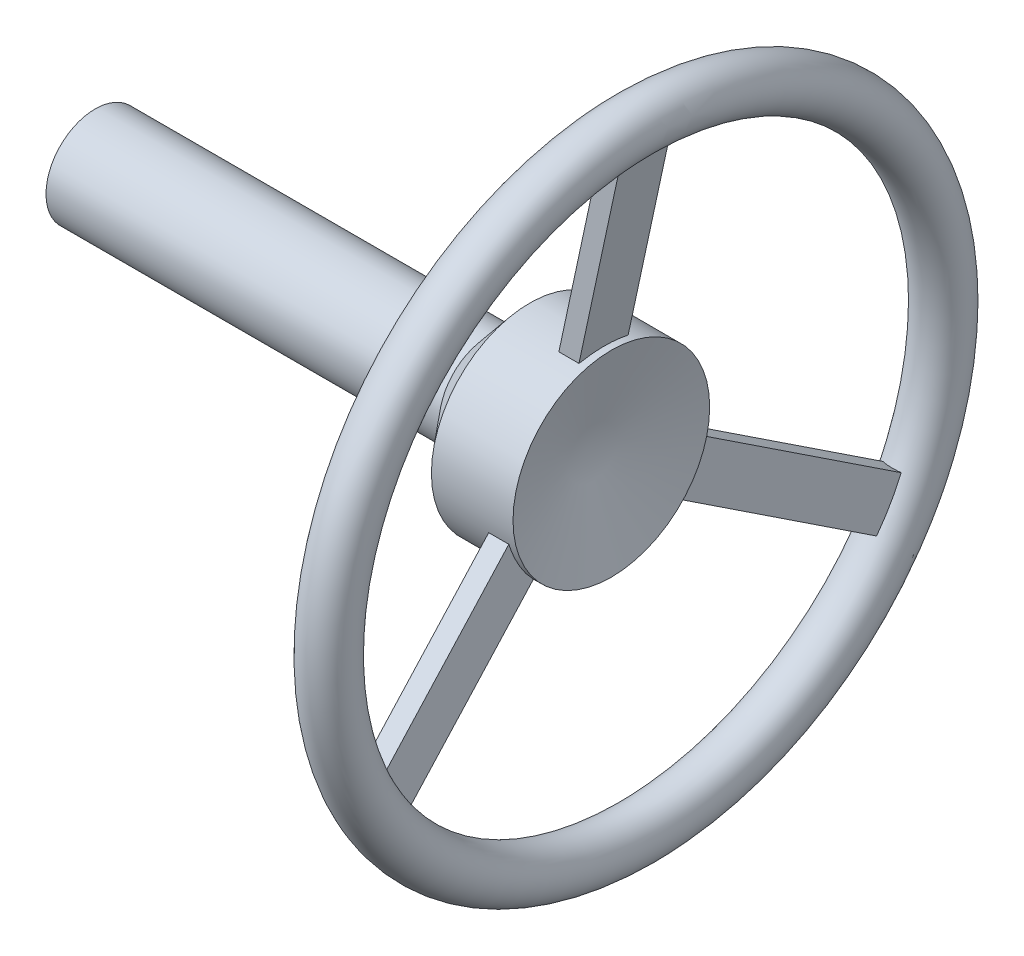
ISO-10303-21;
HEADER;
FILE_DESCRIPTION(('STEP AP214'),'2;1');
FILE_NAME('part.step','',(''),(''),'','','');
FILE_SCHEMA(('AUTOMOTIVE_DESIGN { 1 0 10303 214 1 1 1 1 }'));
ENDSEC;
DATA;
#1=APPLICATION_CONTEXT('core data for automotive mechanical design processes');
#2=APPLICATION_PROTOCOL_DEFINITION('international standard','automotive_design',2000,#1);
#3=PRODUCT_CONTEXT('',#1,'mechanical');
#4=PRODUCT('Part','Part','',(#3));
#5=PRODUCT_RELATED_PRODUCT_CATEGORY('part','',(#4));
#6=PRODUCT_DEFINITION_FORMATION('','',#4);
#7=PRODUCT_DEFINITION_CONTEXT('part definition',#1,'design');
#8=PRODUCT_DEFINITION('design','',#6,#7);
#9=PRODUCT_DEFINITION_SHAPE('','',#8);
#10=(LENGTH_UNIT() NAMED_UNIT(*) SI_UNIT(.MILLI.,.METRE.));
#11=(NAMED_UNIT(*) PLANE_ANGLE_UNIT() SI_UNIT($,.RADIAN.));
#12=(NAMED_UNIT(*) SI_UNIT($,.STERADIAN.) SOLID_ANGLE_UNIT());
#13=UNCERTAINTY_MEASURE_WITH_UNIT(LENGTH_MEASURE(1.E-05),#10,'distance_accuracy_value','');
#14=(GEOMETRIC_REPRESENTATION_CONTEXT(3) GLOBAL_UNCERTAINTY_ASSIGNED_CONTEXT((#13)) GLOBAL_UNIT_ASSIGNED_CONTEXT((#10,
#11,#12)) REPRESENTATION_CONTEXT('',''));
#15=CARTESIAN_POINT('',(0.,0.,0.));
#16=DIRECTION('',(0.,0.,1.));
#17=DIRECTION('',(1.,0.,0.));
#18=AXIS2_PLACEMENT_3D('',#15,#16,#17);
#19=CARTESIAN_POINT('',(-81.8695941450432,0.,0.));
#20=DIRECTION('',(-1.,0.,0.));
#21=DIRECTION('',(0.,0.,1.));
#22=AXIS2_PLACEMENT_3D('',#19,#20,#21);
#23=CYLINDRICAL_SURFACE('',#22,10.);
#24=DIRECTION('',(-1.,0.,0.));
#25=VECTOR('',#24,1.);
#26=CARTESIAN_POINT('',(-81.8695941450432,-7.0062926922203,7.13525491562427));
#27=LINE('',#26,#25);
#28=CARTESIAN_POINT('',(49.658011720403,-7.0062926922203,7.13525491562427));
#29=VERTEX_POINT('',#28);
#30=CARTESIAN_POINT('',(51.7036199719426,-7.0062926922203,7.13525491562427));
#31=VERTEX_POINT('',#30);
#32=EDGE_CURVE('E297',#29,#31,#27,.F.);
#33=ORIENTED_EDGE('',*,*,#32,.F.);
#34=CARTESIAN_POINT('',(47.5784621968035,0.,0.));
#35=DIRECTION('',(0.977704307994792,0.104993197551584,-0.181853552608464));
#36=DIRECTION('',(-0.209986395103172,0.488852153997388,-0.846716768112979));
#37=AXIS2_PLACEMENT_3D('',#34,#35,#36);
#38=ELLIPSE('',#37,10.2280412576982,10.);
#39=CARTESIAN_POINT('',(49.658011720403,-2.67616567329808,9.63525491562423));
#40=VERTEX_POINT('',#39);
#41=EDGE_CURVE('E295',#40,#29,#38,.T.);
#42=ORIENTED_EDGE('',*,*,#41,.F.);
#43=DIRECTION('',(-1.,0.,0.));
#44=VECTOR('',#43,1.);
#45=CARTESIAN_POINT('',(-81.8695941450432,-2.67616567329808,9.63525491562424));
#46=LINE('',#45,#44);
#47=CARTESIAN_POINT('',(51.7036199719426,-2.67616567329808,9.63525491562424));
#48=VERTEX_POINT('',#47);
#49=EDGE_CURVE('E299',#40,#48,#46,.F.);
#50=ORIENTED_EDGE('',*,*,#49,.T.);
#51=CARTESIAN_POINT('',(49.624070448343,0.,0.));
#52=DIRECTION('',(-0.977704307994792,-0.104993197551585,0.181853552608465));
#53=DIRECTION('',(-0.209986395103173,0.488852153997388,-0.846716768112979));
#54=AXIS2_PLACEMENT_3D('',#51,#52,#53);
#55=ELLIPSE('',#54,10.2280412576982,10.);
#56=EDGE_CURVE('E151',#31,#48,#55,.T.);
#57=ORIENTED_EDGE('',*,*,#56,.F.);
#58=EDGE_LOOP('',(#33,#42,#50,#57));
#59=FACE_BOUND('',#58,.T.);
#60=CARTESIAN_POINT('',(52.4954981558864,0.,0.));
#61=DIRECTION('',(-1.,0.,0.));
#62=DIRECTION('',(0.,0.,1.));
#63=AXIS2_PLACEMENT_3D('',#60,#61,#62);
#64=CIRCLE('',#63,10.);
#65=CARTESIAN_POINT('',(52.4954981558864,0.,10.));
#66=VERTEX_POINT('',#65);
#67=EDGE_CURVE('E243',#66,#66,#64,.T.);
#68=ORIENTED_EDGE('',*,*,#67,.T.);
#69=EDGE_LOOP('',(#68));
#70=FACE_BOUND('',#69,.T.);
#71=CARTESIAN_POINT('',(44.1954981558864,0.,0.));
#72=DIRECTION('',(-1.,0.,0.));
#73=DIRECTION('',(0.,0.,1.));
#74=AXIS2_PLACEMENT_3D('',#71,#72,#73);
#75=CIRCLE('',#74,10.);
#76=CARTESIAN_POINT('',(44.1954981558864,0.,10.));
#77=VERTEX_POINT('',#76);
#78=EDGE_CURVE('E249',#77,#77,#75,.T.);
#79=ORIENTED_EDGE('',*,*,#78,.F.);
#80=EDGE_LOOP('',(#79));
#81=FACE_BOUND('',#80,.T.);
#82=DIRECTION('',(-1.,0.,0.));
#83=VECTOR('',#82,1.);
#84=CARTESIAN_POINT('',(-81.8695941450432,9.68245836551854,2.5));
#85=LINE('',#84,#83);
#86=CARTESIAN_POINT('',(49.658011720403,9.68245836551854,2.5));
#87=VERTEX_POINT('',#86);
#88=CARTESIAN_POINT('',(51.7036199719426,9.68245836551854,2.5));
#89=VERTEX_POINT('',#88);
#90=EDGE_CURVE('E206',#87,#89,#85,.F.);
#91=ORIENTED_EDGE('',*,*,#90,.F.);
#92=CARTESIAN_POINT('',(47.5784621968034,0.,0.));
#93=DIRECTION('',(0.977704307994792,-0.209986395103172,0.));
#94=DIRECTION('',(-0.209986395103172,-0.977704307994792,0.));
#95=AXIS2_PLACEMENT_3D('',#92,#93,#94);
#96=ELLIPSE('',#95,10.2280412576982,10.);
#97=CARTESIAN_POINT('',(49.658011720403,9.68245836551854,-2.5));
#98=VERTEX_POINT('',#97);
#99=EDGE_CURVE('E261',#98,#87,#96,.T.);
#100=ORIENTED_EDGE('',*,*,#99,.F.);
#101=DIRECTION('',(-1.,0.,0.));
#102=VECTOR('',#101,1.);
#103=CARTESIAN_POINT('',(-81.8695941450432,9.68245836551854,-2.5));
#104=LINE('',#103,#102);
#105=CARTESIAN_POINT('',(51.7036199719426,9.68245836551854,-2.5));
#106=VERTEX_POINT('',#105);
#107=EDGE_CURVE('E258',#98,#106,#104,.F.);
#108=ORIENTED_EDGE('',*,*,#107,.T.);
#109=CARTESIAN_POINT('',(49.6240704483431,0.,0.));
#110=DIRECTION('',(-0.977704307994792,0.209986395103173,0.));
#111=DIRECTION('',(-0.209986395103173,-0.977704307994792,0.));
#112=AXIS2_PLACEMENT_3D('',#109,#110,#111);
#113=ELLIPSE('',#112,10.2280412576982,10.);
#114=EDGE_CURVE('E263',#89,#106,#113,.T.);
#115=ORIENTED_EDGE('',*,*,#114,.F.);
#116=EDGE_LOOP('',(#91,#100,#108,#115));
#117=FACE_BOUND('',#116,.T.);
#118=DIRECTION('',(-1.,0.,0.));
#119=VECTOR('',#118,1.);
#120=CARTESIAN_POINT('',(-81.8695941450432,-2.67616567329822,-9.6352549156242));
#121=LINE('',#120,#119);
#122=CARTESIAN_POINT('',(49.658011720403,-2.67616567329822,-9.6352549156242));
#123=VERTEX_POINT('',#122);
#124=CARTESIAN_POINT('',(51.7036199719426,-2.67616567329822,-9.6352549156242));
#125=VERTEX_POINT('',#124);
#126=EDGE_CURVE('E289',#123,#125,#121,.F.);
#127=ORIENTED_EDGE('',*,*,#126,.F.);
#128=CARTESIAN_POINT('',(47.5784621968034,0.,0.));
#129=DIRECTION('',(0.977704307994792,0.104993197551587,0.181853552608463));
#130=DIRECTION('',(-0.209986395103172,0.4888521539974,0.846716768112972));
#131=AXIS2_PLACEMENT_3D('',#128,#129,#130);
#132=ELLIPSE('',#131,10.2280412576982,10.);
#133=CARTESIAN_POINT('',(49.658011720403,-7.0062926922204,-7.13525491562418));
#134=VERTEX_POINT('',#133);
#135=EDGE_CURVE('E282',#134,#123,#132,.T.);
#136=ORIENTED_EDGE('',*,*,#135,.F.);
#137=DIRECTION('',(-1.,0.,0.));
#138=VECTOR('',#137,1.);
#139=CARTESIAN_POINT('',(-81.8695941450432,-7.0062926922204,-7.13525491562418));
#140=LINE('',#139,#138);
#141=CARTESIAN_POINT('',(51.7036199719426,-7.0062926922204,-7.13525491562418));
#142=VERTEX_POINT('',#141);
#143=EDGE_CURVE('E291',#134,#142,#140,.F.);
#144=ORIENTED_EDGE('',*,*,#143,.T.);
#145=CARTESIAN_POINT('',(49.6240704483431,0.,0.));
#146=DIRECTION('',(-0.977704307994792,-0.104993197551587,-0.181853552608463));
#147=DIRECTION('',(-0.209986395103172,0.4888521539974,0.846716768112972));
#148=AXIS2_PLACEMENT_3D('',#145,#146,#147);
#149=ELLIPSE('',#148,10.2280412576982,10.);
#150=EDGE_CURVE('E281',#125,#142,#149,.T.);
#151=ORIENTED_EDGE('',*,*,#150,.F.);
#152=EDGE_LOOP('',(#127,#136,#144,#151));
#153=FACE_BOUND('',#152,.T.);
#154=ADVANCED_FACE('F39',(#59,#70,#81,#117,#153),#23,.T.);
#155=CARTESIAN_POINT('',(55.,0.,0.));
#156=DIRECTION('',(-1.,0.,0.));
#157=DIRECTION('',(0.,0.,1.));
#158=AXIS2_PLACEMENT_3D('',#155,#156,#157);
#159=TOROIDAL_SURFACE('',#158,31.25,2.50000000000001);
#160=CARTESIAN_POINT('',(56.0202,-16.5948404700643,23.743106837652));
#161=CARTESIAN_POINT('',(55.9562580064985,-16.5804924106329,23.7182552697269));
#162=CARTESIAN_POINT('',(55.8911044324304,-16.5674980290198,23.6957483405601));
#163=CARTESIAN_POINT('',(55.7588447645869,-16.5442957466509,23.6555608086457));
#164=CARTESIAN_POINT('',(55.6917387472024,-16.5340877370377,23.6378800173514));
#165=CARTESIAN_POINT('',(55.5560843170221,-16.5165419528924,23.6074898277531));
#166=CARTESIAN_POINT('',(55.4875368802997,-16.5092022980423,23.5947771726427));
#167=CARTESIAN_POINT('',(55.3494695785665,-16.4974346826149,23.5743950648385));
#168=CARTESIAN_POINT('',(55.2799497282491,-16.4930066780904,23.566725536026));
#169=CARTESIAN_POINT('',(55.0705813887959,-16.4841484611507,23.5513826542218));
#170=CARTESIAN_POINT('',(54.9298764284403,-16.4841378990019,23.5513643600436));
#171=CARTESIAN_POINT('',(54.6505831642041,-16.495936978801,23.5718009657381));
#172=CARTESIAN_POINT('',(54.511994221356,-16.5077429778851,23.5922495559859));
#173=CARTESIAN_POINT('',(54.2408103780731,-16.5428055464577,23.6529797061976));
#174=CARTESIAN_POINT('',(54.108211869934,-16.5660551209827,23.6932491505291));
#175=CARTESIAN_POINT('',(53.8526050728537,-16.6233529158312,23.7924918423685));
#176=CARTESIAN_POINT('',(53.7296025645605,-16.6574075835295,23.8514762570568));
#177=CARTESIAN_POINT('',(53.496453303417,-16.7354134376798,23.9865863597328));
#178=CARTESIAN_POINT('',(53.3863396774834,-16.7793893105067,24.0627548057762));
#179=CARTESIAN_POINT('',(53.1825364817182,-16.8758929197115,24.2299039600328));
#180=CARTESIAN_POINT('',(53.0888150167831,-16.9284036562296,24.320855223625));
#181=CARTESIAN_POINT('',(52.9873310286367,-16.995860434063,24.4376937901473));
#182=CARTESIAN_POINT('',(52.9704361296399,-17.0075036723224,24.4578604703772));
#183=CARTESIAN_POINT('',(52.9374777881872,-17.0310588041472,24.4986591554768));
#184=CARTESIAN_POINT('',(52.9214133209462,-17.0429703392212,24.5192905394211));
#185=CARTESIAN_POINT('',(52.9057558893905,-17.0550195170738,24.5401603276511));
#186=B_SPLINE_CURVE_WITH_KNOTS('',3,(#160,#161,#162,#163,#164,#165,#166,#167,#168,#169,#170,
#171,#172,#173,#174,#175,#176,#177,#178,#179,#180,#181,#182,#183,#184,#185),.UNSPECIFIED.,.F.,
.F.,(4,2,2,2,2,2,2,2,2,2,2,2,4),(0.,0.210190253927627,0.420372295005681,0.630416321532705,
0.840457177666436,1.26039302752507,1.68019945749629,2.09974959600251,2.51955055143011,
2.94040782571381,3.36043687831281,3.44673830901297,3.53293056532568),.UNSPECIFIED.);
#187=CARTESIAN_POINT('',(55.8041006910102,-16.5522865217543,23.6694012371165));
#188=VERTEX_POINT('',#187);
#189=CARTESIAN_POINT('',(53.7964224813816,-16.6405883504528,23.8223444908236));
#190=VERTEX_POINT('',#189);
#191=EDGE_CURVE('E157',#188,#190,#186,.T.);
#192=ORIENTED_EDGE('',*,*,#191,.F.);
#193=CARTESIAN_POINT('',(55.7370161618666,-10.0892644920541,27.0401603276509));
#194=CARTESIAN_POINT('',(55.7530257267715,-10.484801798354,26.8978694260353));
#195=CARTESIAN_POINT('',(55.7669935136158,-10.8771473153596,26.7464440367062));
#196=CARTESIAN_POINT('',(55.7907768574856,-11.654551922055,26.4254763302686));
#197=CARTESIAN_POINT('',(55.8005917916048,-12.0396099103849,26.255931300082));
#198=CARTESIAN_POINT('',(55.8159404703266,-12.798675515298,25.9002040966537));
#199=CARTESIAN_POINT('',(55.8215045241332,-13.1727427244341,25.714150469851));
#200=CARTESIAN_POINT('',(55.8284316243212,-13.9117288529762,25.3247389908318));
#201=CARTESIAN_POINT('',(55.8297952469691,-14.2766490204711,25.1213835162283));
#202=CARTESIAN_POINT('',(55.828194023155,-15.0529663957021,24.6645677665775));
#203=CARTESIAN_POINT('',(55.8245172926269,-15.4626841343252,24.4082498113896));
#204=CARTESIAN_POINT('',(55.8115444281072,-16.2693139907025,23.8727954746835));
#205=CARTESIAN_POINT('',(55.8022248114087,-16.6661652541777,23.5935679766705));
#206=CARTESIAN_POINT('',(55.7901076462764,-17.0551040470208,23.3038682083276));
#207=B_SPLINE_CURVE_WITH_KNOTS('',3,(#193,#194,#195,#196,#197,#198,#199,#200,#201,#202,#203,
#204,#205,#206),.UNSPECIFIED.,.F.,.F.,(4,2,2,2,2,2,4),(0.,1.26187312144618,2.52393545025247,
3.77691292841994,5.02971850016673,6.47887277943734,7.93409952218406),.UNSPECIFIED.);
#208=CARTESIAN_POINT('',(55.8041006910102,-12.2221595028321,26.1694012371164));
#209=VERTEX_POINT('',#208);
#210=EDGE_CURVE('E148',#209,#188,#207,.T.);
#211=ORIENTED_EDGE('',*,*,#210,.F.);
#212=CARTESIAN_POINT('',(56.0202,-12.264713451142,26.243106837652));
#213=CARTESIAN_POINT('',(55.9562580064985,-12.2503653917107,26.2182552697268));
#214=CARTESIAN_POINT('',(55.8911044324304,-12.2373710100976,26.19574834056));
#215=CARTESIAN_POINT('',(55.7588447645869,-12.2141687277287,26.1555608086456));
#216=CARTESIAN_POINT('',(55.6917387472024,-12.2039607181155,26.1378800173513));
#217=CARTESIAN_POINT('',(55.5560843170221,-12.1864149339702,26.1074898277531));
#218=CARTESIAN_POINT('',(55.4875368802997,-12.1790752791201,26.0947771726426));
#219=CARTESIAN_POINT('',(55.3494695785665,-12.1673076636927,26.0743950648385));
#220=CARTESIAN_POINT('',(55.2799497282491,-12.1628796591682,26.0667255360259));
#221=CARTESIAN_POINT('',(55.0705813887959,-12.1540214422285,26.0513826542218));
#222=CARTESIAN_POINT('',(54.9298764284403,-12.1540108800797,26.0513643600435));
#223=CARTESIAN_POINT('',(54.6505831642041,-12.1658099598788,26.0718009657381));
#224=CARTESIAN_POINT('',(54.511994221356,-12.1776159589629,26.0922495559858));
#225=CARTESIAN_POINT('',(54.2408103780731,-12.2126785275355,26.1529797061975));
#226=CARTESIAN_POINT('',(54.108211869934,-12.2359281020605,26.1932491505291));
#227=CARTESIAN_POINT('',(53.8526050728537,-12.293225896909,26.2924918423684));
#228=CARTESIAN_POINT('',(53.7296025645605,-12.3272805646073,26.3514762570568));
#229=CARTESIAN_POINT('',(53.496453303417,-12.4052864187575,26.4865863597328));
#230=CARTESIAN_POINT('',(53.3863396774834,-12.4492622915844,26.5627548057762));
#231=CARTESIAN_POINT('',(53.1825364817182,-12.5457659007893,26.7299039600328));
#232=CARTESIAN_POINT('',(53.0888150167831,-12.5982766373074,26.820855223625));
#233=CARTESIAN_POINT('',(52.9873310286367,-12.6657334151407,26.9376937901472));
#234=CARTESIAN_POINT('',(52.9704361296399,-12.6773766534001,26.9578604703771));
#235=CARTESIAN_POINT('',(52.9374777881873,-12.7009317852249,26.9986591554766));
#236=CARTESIAN_POINT('',(52.9214133209463,-12.7128433202989,27.0192905394209));
#237=CARTESIAN_POINT('',(52.9057558893906,-12.7248924981514,27.0401603276509));
#238=B_SPLINE_CURVE_WITH_KNOTS('',3,(#212,#213,#214,#215,#216,#217,#218,#219,#220,#221,#222,
#223,#224,#225,#226,#227,#228,#229,#230,#231,#232,#233,#234,#235,#236,#237),.UNSPECIFIED.,.F.,
.F.,(4,2,2,2,2,2,2,2,2,2,2,2,4),(0.,0.210190253927627,0.42037229500568,0.630416321532705,
0.840457177666435,1.26039302752507,1.68019945749629,2.09974959600251,2.51955055143011,
2.94040782571381,3.3604368783128,3.44673830901286,3.53293056532545),.UNSPECIFIED.);
#239=CARTESIAN_POINT('',(53.7964224813816,-12.3104613315306,26.3223444908236));
#240=VERTEX_POINT('',#239);
#241=EDGE_CURVE('E134',#209,#240,#238,.T.);
#242=ORIENTED_EDGE('',*,*,#241,.T.);
#243=CARTESIAN_POINT('',(53.7872342701488,-17.0551040470203,23.5336249064659));
#244=CARTESIAN_POINT('',(53.795555933973,-16.7129580893264,23.7759029596922));
#245=CARTESIAN_POINT('',(53.8021494312237,-16.3661093724161,24.0116049622485));
#246=CARTESIAN_POINT('',(53.8118597834137,-15.6634905029338,24.4694681919797));
#247=CARTESIAN_POINT('',(53.8149762910167,-15.3077194626887,24.6916280642581));
#248=CARTESIAN_POINT('',(53.8177045531651,-14.5894227025095,25.1210049237037));
#249=CARTESIAN_POINT('',(53.8173319610761,-14.2269344258253,25.3282844506243));
#250=CARTESIAN_POINT('',(53.8131228575028,-13.4942742124145,25.7286565015633));
#251=CARTESIAN_POINT('',(53.8092867196714,-13.1241031087322,25.9217505535037));
#252=CARTESIAN_POINT('',(53.7987365020802,-12.4146904386611,26.2746087215449));
#253=CARTESIAN_POINT('',(53.7923550497785,-12.0761351807076,26.4357649115308));
#254=CARTESIAN_POINT('',(53.7768283078477,-11.3930577954556,26.7466629697043));
#255=CARTESIAN_POINT('',(53.7676774514735,-11.0485249800104,26.8963810800501));
#256=CARTESIAN_POINT('',(53.7571621416415,-10.701572686531,27.0401603276509));
#257=B_SPLINE_CURVE_WITH_KNOTS('',3,(#243,#244,#245,#246,#247,#248,#249,#250,#251,#252,#253,
#254,#255,#256),.UNSPECIFIED.,.F.,.F.,(4,2,2,2,2,2,4),(0.,1.25789305551489,2.51591175794896,
3.76828924615167,5.02053164200941,6.1453306190178,7.27240572920683),.UNSPECIFIED.);
#258=EDGE_CURVE('E142',#190,#240,#257,.T.);
#259=ORIENTED_EDGE('',*,*,#258,.F.);
#260=EDGE_LOOP('',(#192,#211,#242,#259));
#261=FACE_BOUND('',#260,.T.);
#262=CARTESIAN_POINT('',(53.4225181821183,29.2037165368697,2.5));
#263=CARTESIAN_POINT('',(53.5311347709092,29.115057334413,2.5));
#264=CARTESIAN_POINT('',(53.6472974072003,29.0354847569837,2.5));
#265=CARTESIAN_POINT('',(53.8914228865271,28.8968942138501,2.5));
#266=CARTESIAN_POINT('',(54.0193992705158,28.8379002147948,2.5));
#267=CARTESIAN_POINT('',(54.2834143368991,28.7422754231103,2.5));
#268=CARTESIAN_POINT('',(54.4194501439651,28.7056367069599,2.5));
#269=CARTESIAN_POINT('',(54.6957108979399,28.6557759153569,2.5));
#270=CARTESIAN_POINT('',(54.8359348045861,28.6425480733715,2.5));
#271=CARTESIAN_POINT('',(55.116372259917,28.6398764393678,2.5));
#272=CARTESIAN_POINT('',(55.2565854269708,28.6503925596618,2.5));
#273=CARTESIAN_POINT('',(55.5332586060295,28.6948215576254,2.5));
#274=CARTESIAN_POINT('',(55.6697184922172,28.7287352186349,2.5));
#275=CARTESIAN_POINT('',(55.9349873234043,28.8189663899003,2.5));
#276=CARTESIAN_POINT('',(56.0637977338432,28.8752795929734,2.5));
#277=CARTESIAN_POINT('',(56.3101658320701,29.0086841933537,2.5));
#278=CARTESIAN_POINT('',(56.427723430778,29.0857757551289,2.5));
#279=CARTESIAN_POINT('',(56.6485468082462,29.2587269556003,2.5));
#280=CARTESIAN_POINT('',(56.7517791279723,29.3546293108108,2.5));
#281=CARTESIAN_POINT('',(56.9407471943776,29.5623498263616,2.5));
#282=CARTESIAN_POINT('',(57.0264826471575,29.6741682539947,2.5));
#283=CARTESIAN_POINT('',(57.178341920481,29.9109675687772,2.5));
#284=CARTESIAN_POINT('',(57.2443958676542,30.0359932664648,2.5));
#285=CARTESIAN_POINT('',(57.3546475834238,30.295336373743,2.5));
#286=CARTESIAN_POINT('',(57.398844945586,30.429653956068,2.5));
#287=CARTESIAN_POINT('',(57.4642508252189,30.7041934957069,2.5));
#288=CARTESIAN_POINT('',(57.485391294969,30.8444316681622,2.5));
#289=CARTESIAN_POINT('',(57.5038571022998,31.1264679084592,2.5));
#290=CARTESIAN_POINT('',(57.5011822389915,31.268265989449,2.5));
#291=CARTESIAN_POINT('',(57.4720690475805,31.5495595117164,2.5));
#292=CARTESIAN_POINT('',(57.4456047445757,31.6890522663006,2.5));
#293=CARTESIAN_POINT('',(57.3696093053451,31.9616071717177,2.5));
#294=CARTESIAN_POINT('',(57.3200782293983,32.0946693393544,2.5));
#295=CARTESIAN_POINT('',(57.1993952526741,32.3504333657206,2.5));
#296=CARTESIAN_POINT('',(57.1282654793587,32.473145664065,2.5));
#297=CARTESIAN_POINT('',(56.966365354043,32.7048475796096,2.5));
#298=CARTESIAN_POINT('',(56.8755952364201,32.8138373605423,2.5));
#299=CARTESIAN_POINT('',(56.6772282020653,33.0147079203379,2.5));
#300=CARTESIAN_POINT('',(56.5696735640598,33.1066304495974,2.5));
#301=CARTESIAN_POINT('',(56.3406212328421,33.2710525430909,2.5));
#302=CARTESIAN_POINT('',(56.2191237549165,33.3435524071655,2.5));
#303=CARTESIAN_POINT('',(55.9660041554375,33.4668576420649,2.5));
#304=CARTESIAN_POINT('',(55.8344116215724,33.5177237526288,2.5));
#305=CARTESIAN_POINT('',(55.5645441260655,33.5965890212619,2.5));
#306=CARTESIAN_POINT('',(55.4262692525074,33.6245884806627,2.5));
#307=CARTESIAN_POINT('',(55.147272485229,33.6568767138164,2.5));
#308=CARTESIAN_POINT('',(55.0065563160312,33.6612149693562,2.5));
#309=CARTESIAN_POINT('',(54.7263958038088,33.64618890772,2.5));
#310=CARTESIAN_POINT('',(54.5869514535337,33.6268247257556,2.5));
#311=CARTESIAN_POINT('',(54.3133834445207,33.5649723641704,2.5));
#312=CARTESIAN_POINT('',(54.1792564651084,33.5224988682781,2.5));
#313=CARTESIAN_POINT('',(53.9200265732565,33.4156591838985,2.5));
#314=CARTESIAN_POINT('',(53.7949236766858,33.3512929569139,2.5));
#315=CARTESIAN_POINT('',(53.5571482446115,33.2024355974458,2.5));
#316=CARTESIAN_POINT('',(53.4444886058528,33.1179238664415,2.5));
#317=CARTESIAN_POINT('',(53.2349148398219,32.9312265204446,2.5));
#318=CARTESIAN_POINT('',(53.1380009117776,32.8290406818581,2.5));
#319=CARTESIAN_POINT('',(52.9624222280615,32.6096437272084,2.5));
#320=CARTESIAN_POINT('',(52.8838007974227,32.4923979405092,2.5));
#321=CARTESIAN_POINT('',(52.7472925332808,32.2464006000889,2.5));
#322=CARTESIAN_POINT('',(52.689406060348,32.1176488463335,2.5));
#323=CARTESIAN_POINT('',(52.5958385180933,31.8518997836324,2.5));
#324=CARTESIAN_POINT('',(52.5602215017058,31.7148799215508,2.5));
#325=CARTESIAN_POINT('',(52.5124412863024,31.4368152914431,2.5));
#326=CARTESIAN_POINT('',(52.5002775084322,31.2957706228413,2.5));
#327=CARTESIAN_POINT('',(52.499731311667,31.0133350105468,2.5));
#328=CARTESIAN_POINT('',(52.5113995352409,30.8719439684791,2.5));
#329=CARTESIAN_POINT('',(52.5582984682584,30.5930848528661,2.5));
#330=CARTESIAN_POINT('',(52.5935351629297,30.455617785065,2.5));
#331=CARTESIAN_POINT('',(52.6866269253941,30.1884195396623,2.5));
#332=CARTESIAN_POINT('',(52.7445056217374,30.0586966071554,2.5));
#333=CARTESIAN_POINT('',(52.8812225389862,29.8109490350143,2.5));
#334=CARTESIAN_POINT('',(52.9600354403236,29.6929104984686,2.5));
#335=CARTESIAN_POINT('',(53.1036005837237,29.5128731935703,2.5));
#336=CARTESIAN_POINT('',(53.1627381825459,29.4463187348657,2.5));
#337=CARTESIAN_POINT('',(53.2877442737419,29.3198627188682,2.5));
#338=CARTESIAN_POINT('',(53.353612765883,29.2599611613453,2.5));
#339=CARTESIAN_POINT('',(53.4225181821183,29.2037165368697,2.5));
#340=B_SPLINE_CURVE_WITH_KNOTS('',3,(#262,#263,#264,#265,#266,#267,#268,#269,#270,#271,#272,
#273,#274,#275,#276,#277,#278,#279,#280,#281,#282,#283,#284,#285,#286,#287,#288,#289,#290,#291,
#292,#293,#294,#295,#296,#297,#298,#299,#300,#301,#302,#303,#304,#305,#306,#307,#308,#309,#310,
#311,#312,#313,#314,#315,#316,#317,#318,#319,#320,#321,#322,#323,#324,#325,#326,#327,#328,#329,
#330,#331,#332,#333,#334,#335,#336,#337,#338,#339),.UNSPECIFIED.,.T.,.F.,(4,2,2,2,2,2,2,2,2,2,2,
2,2,2,2,2,2,2,2,2,2,2,2,2,2,2,2,2,2,2,2,2,2,2,2,2,2,2,4),(0.,0.420297805795015,
0.841083485887334,1.26171993754006,1.682252764202,2.10207612290683,2.52191353780276,
2.94167026162994,3.36143030807829,3.78215483953348,4.20288643742271,4.62509439258925,
5.0473101986281,5.47076874462091,5.89423086260955,6.31815590723021,6.74207984404099,
7.16557093564941,7.58905697382077,8.01149301193264,8.43392252823888,8.85515805817787,
9.27638803708152,9.6967367748194,10.1170831146712,10.5371626765657,10.9572429771501,
11.377754660948,11.7982716649977,12.219774731775,12.6412851279176,13.0640023902787,
13.486709219334,13.9103152254121,14.3340288473603,14.7581858294705,15.1818321185595,
15.4484653886204,15.7150986494644),.UNSPECIFIED.);
#341=CARTESIAN_POINT('',(53.7964224813817,28.9510496819839,2.5));
#342=VERTEX_POINT('',#341);
#343=CARTESIAN_POINT('',(55.8041006910103,28.7744460245868,2.5));
#344=VERTEX_POINT('',#343);
#345=EDGE_CURVE('E232',#342,#344,#340,.T.);
#346=ORIENTED_EDGE('',*,*,#345,.T.);
#347=CARTESIAN_POINT('',(55.8040966639046,28.7744272742362,2.5002));
#348=CARTESIAN_POINT('',(55.8208648689317,28.8525006479151,1.6668));
#349=CARTESIAN_POINT('',(55.8292489714453,28.8915373347545,0.8334));
#350=CARTESIAN_POINT('',(55.8292489714453,28.8915373347545,-0.8334));
#351=CARTESIAN_POINT('',(55.8208648689317,28.8525006479151,-1.6668));
#352=CARTESIAN_POINT('',(55.8040966639046,28.7744272742362,-2.5002));
#353=B_SPLINE_CURVE_WITH_KNOTS('',3,(#347,#348,#349,#350,#351,#352),.UNSPECIFIED.,.F.,.F.,(4,2,
4),(0.,2.50306760692739,5.00613521385478),.UNSPECIFIED.);
#354=CARTESIAN_POINT('',(55.8041006910103,28.7744460245868,-2.5));
#355=VERTEX_POINT('',#354);
#356=EDGE_CURVE('E223',#344,#355,#353,.T.);
#357=ORIENTED_EDGE('',*,*,#356,.T.);
#358=CARTESIAN_POINT('',(53.4225181821183,29.2037165368697,-2.5));
#359=CARTESIAN_POINT('',(53.5311347709092,29.115057334413,-2.5));
#360=CARTESIAN_POINT('',(53.6472974072003,29.0354847569837,-2.5));
#361=CARTESIAN_POINT('',(53.8914228865271,28.8968942138501,-2.5));
#362=CARTESIAN_POINT('',(54.0193992705158,28.8379002147948,-2.5));
#363=CARTESIAN_POINT('',(54.2834143368991,28.7422754231103,-2.5));
#364=CARTESIAN_POINT('',(54.4194501439651,28.7056367069599,-2.5));
#365=CARTESIAN_POINT('',(54.6957108979399,28.6557759153569,-2.5));
#366=CARTESIAN_POINT('',(54.8359348045861,28.6425480733715,-2.5));
#367=CARTESIAN_POINT('',(55.116372259917,28.6398764393678,-2.5));
#368=CARTESIAN_POINT('',(55.2565854269708,28.6503925596618,-2.5));
#369=CARTESIAN_POINT('',(55.5332586060295,28.6948215576254,-2.5));
#370=CARTESIAN_POINT('',(55.6697184922172,28.7287352186349,-2.5));
#371=CARTESIAN_POINT('',(55.9349873234043,28.8189663899003,-2.5));
#372=CARTESIAN_POINT('',(56.0637977338432,28.8752795929734,-2.5));
#373=CARTESIAN_POINT('',(56.3101658320701,29.0086841933537,-2.5));
#374=CARTESIAN_POINT('',(56.427723430778,29.0857757551289,-2.5));
#375=CARTESIAN_POINT('',(56.6485468082462,29.2587269556003,-2.5));
#376=CARTESIAN_POINT('',(56.7517791279723,29.3546293108108,-2.5));
#377=CARTESIAN_POINT('',(56.9407471943776,29.5623498263616,-2.5));
#378=CARTESIAN_POINT('',(57.0264826471575,29.6741682539947,-2.5));
#379=CARTESIAN_POINT('',(57.178341920481,29.9109675687772,-2.5));
#380=CARTESIAN_POINT('',(57.2443958676542,30.0359932664648,-2.5));
#381=CARTESIAN_POINT('',(57.3546475834238,30.295336373743,-2.5));
#382=CARTESIAN_POINT('',(57.398844945586,30.429653956068,-2.5));
#383=CARTESIAN_POINT('',(57.4642508252189,30.7041934957069,-2.5));
#384=CARTESIAN_POINT('',(57.485391294969,30.8444316681622,-2.5));
#385=CARTESIAN_POINT('',(57.5038571022998,31.1264679084592,-2.5));
#386=CARTESIAN_POINT('',(57.5011822389915,31.268265989449,-2.5));
#387=CARTESIAN_POINT('',(57.4720690475805,31.5495595117164,-2.5));
#388=CARTESIAN_POINT('',(57.4456047445757,31.6890522663006,-2.5));
#389=CARTESIAN_POINT('',(57.3696093053451,31.9616071717177,-2.5));
#390=CARTESIAN_POINT('',(57.3200782293983,32.0946693393544,-2.5));
#391=CARTESIAN_POINT('',(57.1993952526741,32.3504333657206,-2.5));
#392=CARTESIAN_POINT('',(57.1282654793587,32.473145664065,-2.5));
#393=CARTESIAN_POINT('',(56.966365354043,32.7048475796096,-2.5));
#394=CARTESIAN_POINT('',(56.8755952364201,32.8138373605423,-2.5));
#395=CARTESIAN_POINT('',(56.6772282020653,33.0147079203379,-2.5));
#396=CARTESIAN_POINT('',(56.5696735640598,33.1066304495974,-2.5));
#397=CARTESIAN_POINT('',(56.3406212328421,33.2710525430909,-2.5));
#398=CARTESIAN_POINT('',(56.2191237549165,33.3435524071655,-2.5));
#399=CARTESIAN_POINT('',(55.9660041554375,33.4668576420649,-2.5));
#400=CARTESIAN_POINT('',(55.8344116215724,33.5177237526288,-2.5));
#401=CARTESIAN_POINT('',(55.5645441260655,33.5965890212619,-2.5));
#402=CARTESIAN_POINT('',(55.4262692525074,33.6245884806627,-2.5));
#403=CARTESIAN_POINT('',(55.147272485229,33.6568767138164,-2.5));
#404=CARTESIAN_POINT('',(55.0065563160312,33.6612149693562,-2.5));
#405=CARTESIAN_POINT('',(54.7263958038088,33.64618890772,-2.5));
#406=CARTESIAN_POINT('',(54.5869514535337,33.6268247257556,-2.5));
#407=CARTESIAN_POINT('',(54.3133834445207,33.5649723641704,-2.5));
#408=CARTESIAN_POINT('',(54.1792564651084,33.5224988682781,-2.5));
#409=CARTESIAN_POINT('',(53.9200265732565,33.4156591838985,-2.5));
#410=CARTESIAN_POINT('',(53.7949236766858,33.3512929569139,-2.5));
#411=CARTESIAN_POINT('',(53.5571482446115,33.2024355974458,-2.5));
#412=CARTESIAN_POINT('',(53.4444886058528,33.1179238664415,-2.5));
#413=CARTESIAN_POINT('',(53.2349148398219,32.9312265204446,-2.5));
#414=CARTESIAN_POINT('',(53.1380009117776,32.8290406818581,-2.5));
#415=CARTESIAN_POINT('',(52.9624222280615,32.6096437272084,-2.5));
#416=CARTESIAN_POINT('',(52.8838007974227,32.4923979405092,-2.5));
#417=CARTESIAN_POINT('',(52.7472925332808,32.2464006000889,-2.5));
#418=CARTESIAN_POINT('',(52.689406060348,32.1176488463335,-2.5));
#419=CARTESIAN_POINT('',(52.5958385180933,31.8518997836324,-2.5));
#420=CARTESIAN_POINT('',(52.5602215017058,31.7148799215508,-2.5));
#421=CARTESIAN_POINT('',(52.5124412863024,31.4368152914431,-2.5));
#422=CARTESIAN_POINT('',(52.5002775084322,31.2957706228413,-2.5));
#423=CARTESIAN_POINT('',(52.499731311667,31.0133350105468,-2.5));
#424=CARTESIAN_POINT('',(52.5113995352409,30.8719439684791,-2.5));
#425=CARTESIAN_POINT('',(52.5582984682584,30.5930848528661,-2.5));
#426=CARTESIAN_POINT('',(52.5935351629297,30.455617785065,-2.5));
#427=CARTESIAN_POINT('',(52.6866269253941,30.1884195396623,-2.5));
#428=CARTESIAN_POINT('',(52.7445056217374,30.0586966071554,-2.5));
#429=CARTESIAN_POINT('',(52.8812225389862,29.8109490350143,-2.5));
#430=CARTESIAN_POINT('',(52.9600354403236,29.6929104984686,-2.5));
#431=CARTESIAN_POINT('',(53.1036005837237,29.5128731935703,-2.5));
#432=CARTESIAN_POINT('',(53.1627381825459,29.4463187348657,-2.5));
#433=CARTESIAN_POINT('',(53.2877442737419,29.3198627188682,-2.5));
#434=CARTESIAN_POINT('',(53.353612765883,29.2599611613453,-2.5));
#435=CARTESIAN_POINT('',(53.4225181821183,29.2037165368697,-2.5));
#436=B_SPLINE_CURVE_WITH_KNOTS('',3,(#358,#359,#360,#361,#362,#363,#364,#365,#366,#367,#368,
#369,#370,#371,#372,#373,#374,#375,#376,#377,#378,#379,#380,#381,#382,#383,#384,#385,#386,#387,
#388,#389,#390,#391,#392,#393,#394,#395,#396,#397,#398,#399,#400,#401,#402,#403,#404,#405,#406,
#407,#408,#409,#410,#411,#412,#413,#414,#415,#416,#417,#418,#419,#420,#421,#422,#423,#424,#425,
#426,#427,#428,#429,#430,#431,#432,#433,#434,#435),.UNSPECIFIED.,.T.,.F.,(4,2,2,2,2,2,2,2,2,2,2,
2,2,2,2,2,2,2,2,2,2,2,2,2,2,2,2,2,2,2,2,2,2,2,2,2,2,2,4),(0.,0.420297805795015,
0.841083485887334,1.26171993754006,1.682252764202,2.10207612290683,2.52191353780276,
2.94167026162994,3.36143030807829,3.78215483953348,4.20288643742271,4.62509439258925,
5.0473101986281,5.47076874462091,5.89423086260955,6.31815590723021,6.74207984404099,
7.16557093564941,7.58905697382077,8.01149301193264,8.43392252823888,8.85515805817787,
9.27638803708152,9.6967367748194,10.1170831146712,10.5371626765657,10.9572429771501,
11.377754660948,11.7982716649977,12.219774731775,12.6412851279176,13.0640023902787,
13.486709219334,13.9103152254121,14.3340288473603,14.7581858294705,15.1818321185595,
15.4484653886204,15.7150986494644),.UNSPECIFIED.);
#437=CARTESIAN_POINT('',(53.7964224813817,28.9510496819839,-2.5));
#438=VERTEX_POINT('',#437);
#439=EDGE_CURVE('E279',#438,#355,#436,.T.);
#440=ORIENTED_EDGE('',*,*,#439,.F.);
#441=CARTESIAN_POINT('',(53.7964191646844,28.9510342393209,-2.5002));
#442=CARTESIAN_POINT('',(53.8102363969494,29.0153677762789,-1.6668));
#443=CARTESIAN_POINT('',(53.8171450130819,29.0475345447579,-0.8334));
#444=CARTESIAN_POINT('',(53.8171450130819,29.0475345447579,0.833400000000001));
#445=CARTESIAN_POINT('',(53.8102363969494,29.0153677762789,1.6668));
#446=CARTESIAN_POINT('',(53.7964191646844,28.9510342393209,2.5002));
#447=B_SPLINE_CURVE_WITH_KNOTS('',3,(#441,#442,#443,#444,#445,#446),.UNSPECIFIED.,.F.,.F.,(4,2,
4),(0.,2.50214745963168,5.00429491926335),.UNSPECIFIED.);
#448=EDGE_CURVE('E143',#438,#342,#447,.T.);
#449=ORIENTED_EDGE('',*,*,#448,.T.);
#450=EDGE_LOOP('',(#346,#357,#440,#449));
#451=FACE_BOUND('',#450,.T.);
#452=CARTESIAN_POINT('',(56.0202,-12.2647134511424,-26.2431068376518));
#453=CARTESIAN_POINT('',(55.9562580064985,-12.250365391711,-26.2182552697267));
#454=CARTESIAN_POINT('',(55.8911044324304,-12.237371010098,-26.1957483405599));
#455=CARTESIAN_POINT('',(55.7588447645869,-12.2141687277291,-26.1555608086454));
#456=CARTESIAN_POINT('',(55.6917387472024,-12.2039607181159,-26.1378800173512));
#457=CARTESIAN_POINT('',(55.5560843170221,-12.1864149339706,-26.1074898277529));
#458=CARTESIAN_POINT('',(55.4875368802997,-12.1790752791204,-26.0947771726424));
#459=CARTESIAN_POINT('',(55.3494695785665,-12.1673076636931,-26.0743950648383));
#460=CARTESIAN_POINT('',(55.2799497282491,-12.1628796591686,-26.0667255360258));
#461=CARTESIAN_POINT('',(55.0705813887959,-12.1540214422288,-26.0513826542216));
#462=CARTESIAN_POINT('',(54.9298764284403,-12.1540108800801,-26.0513643600434));
#463=CARTESIAN_POINT('',(54.6505831642041,-12.1658099598791,-26.0718009657379));
#464=CARTESIAN_POINT('',(54.511994221356,-12.1776159589632,-26.0922495559857));
#465=CARTESIAN_POINT('',(54.2408103780731,-12.2126785275359,-26.1529797061974));
#466=CARTESIAN_POINT('',(54.108211869934,-12.2359281020608,-26.1932491505289));
#467=CARTESIAN_POINT('',(53.8526050728537,-12.2932258969094,-26.2924918423683));
#468=CARTESIAN_POINT('',(53.7296025645605,-12.3272805646077,-26.3514762570566));
#469=CARTESIAN_POINT('',(53.496453303417,-12.4052864187579,-26.4865863597326));
#470=CARTESIAN_POINT('',(53.3863396774834,-12.4492622915848,-26.562754805776));
#471=CARTESIAN_POINT('',(53.1825364817182,-12.5457659007897,-26.7299039600326));
#472=CARTESIAN_POINT('',(53.0888150167831,-12.5982766373078,-26.8208552236248));
#473=CARTESIAN_POINT('',(52.9873310286367,-12.6657334151411,-26.937693790147));
#474=CARTESIAN_POINT('',(52.9704361296399,-12.6773766534005,-26.9578604703769));
#475=CARTESIAN_POINT('',(52.9374777881872,-12.7009317852253,-26.9986591554764));
#476=CARTESIAN_POINT('',(52.9214133209463,-12.7128433202993,-27.0192905394207));
#477=CARTESIAN_POINT('',(52.9057558893906,-12.7248924981518,-27.0401603276507));
#478=B_SPLINE_CURVE_WITH_KNOTS('',3,(#452,#453,#454,#455,#456,#457,#458,#459,#460,#461,#462,
#463,#464,#465,#466,#467,#468,#469,#470,#471,#472,#473,#474,#475,#476,#477),.UNSPECIFIED.,.F.,
.F.,(4,2,2,2,2,2,2,2,2,2,2,2,4),(0.,0.210190253927628,0.42037229500568,0.630416321532705,
0.840457177666435,1.26039302752506,1.68019945749629,2.09974959600251,2.51955055143011,
2.94040782571381,3.3604368783128,3.44673830901286,3.53293056532545),.UNSPECIFIED.);
#479=CARTESIAN_POINT('',(55.8041006910102,-12.2221595028324,-26.1694012371162));
#480=VERTEX_POINT('',#479);
#481=CARTESIAN_POINT('',(53.7964224813816,-12.310461331531,-26.3223444908234));
#482=VERTEX_POINT('',#481);
#483=EDGE_CURVE('E11',#480,#482,#478,.T.);
#484=ORIENTED_EDGE('',*,*,#483,.F.);
#485=CARTESIAN_POINT('',(55.7901076462764,-17.0551040470201,-23.3038682083282));
#486=CARTESIAN_POINT('',(55.8006129853951,-16.7177950111974,-23.5550938175726));
#487=CARTESIAN_POINT('',(55.8090178924704,-16.3745541213652,-23.7984515731678));
#488=CARTESIAN_POINT('',(55.8215927602178,-15.6769275820192,-24.2688330543369));
#489=CARTESIAN_POINT('',(55.8257622537536,-15.3225407076251,-24.4958549756186));
#490=CARTESIAN_POINT('',(55.8298153009492,-14.6059932778829,-24.9313443373261));
#491=CARTESIAN_POINT('',(55.8297293626487,-14.2439066547403,-25.1399331141941));
#492=CARTESIAN_POINT('',(55.8253503883806,-13.5104223061297,-25.5398676992765));
#493=CARTESIAN_POINT('',(55.821057879196,-13.1390257522055,-25.7312156632566));
#494=CARTESIAN_POINT('',(55.8072943385486,-12.3290147038219,-26.1248784540618));
#495=CARTESIAN_POINT('',(55.797118583693,-11.8889695062655,-26.324230473746));
#496=CARTESIAN_POINT('',(55.7712220578489,-10.9971436317132,-26.6998981710153));
#497=CARTESIAN_POINT('',(55.7554783102362,-10.5453216241099,-26.8761141809742));
#498=CARTESIAN_POINT('',(55.7370161618666,-10.0892644920546,-27.0401603276507));
#499=B_SPLINE_CURVE_WITH_KNOTS('',3,(#485,#486,#487,#488,#489,#490,#491,#492,#493,#494,#495,
#496,#497,#498),.UNSPECIFIED.,.F.,.F.,(4,2,2,2,2,2,4),(0.,1.26203613935479,2.52421145725678,
3.77733930774121,5.03031025090336,6.47918098206039,7.93410169099552),.UNSPECIFIED.);
#500=CARTESIAN_POINT('',(55.8041006910102,-16.5522865217546,-23.6694012371162));
#501=VERTEX_POINT('',#500);
#502=EDGE_CURVE('E53',#501,#480,#499,.T.);
#503=ORIENTED_EDGE('',*,*,#502,.F.);
#504=CARTESIAN_POINT('',(56.0202,-16.5948404700646,-23.7431068376518));
#505=CARTESIAN_POINT('',(55.9562580064985,-16.5804924106332,-23.7182552697267));
#506=CARTESIAN_POINT('',(55.8911044324304,-16.5674980290201,-23.6957483405598));
#507=CARTESIAN_POINT('',(55.7588447645869,-16.5442957466513,-23.6555608086454));
#508=CARTESIAN_POINT('',(55.6917387472024,-16.534087737038,-23.6378800173512));
#509=CARTESIAN_POINT('',(55.5560843170221,-16.5165419528928,-23.6074898277529));
#510=CARTESIAN_POINT('',(55.4875368802997,-16.5092022980426,-23.5947771726424));
#511=CARTESIAN_POINT('',(55.3494695785665,-16.4974346826153,-23.5743950648383));
#512=CARTESIAN_POINT('',(55.2799497282491,-16.4930066780908,-23.5667255360257));
#513=CARTESIAN_POINT('',(55.0705813887959,-16.484148461151,-23.5513826542216));
#514=CARTESIAN_POINT('',(54.9298764284403,-16.4841378990023,-23.5513643600434));
#515=CARTESIAN_POINT('',(54.6505831642041,-16.4959369788013,-23.5718009657379));
#516=CARTESIAN_POINT('',(54.511994221356,-16.5077429778854,-23.5922495559856));
#517=CARTESIAN_POINT('',(54.2408103780731,-16.5428055464581,-23.6529797061973));
#518=CARTESIAN_POINT('',(54.108211869934,-16.566055120983,-23.6932491505289));
#519=CARTESIAN_POINT('',(53.8526050728537,-16.6233529158316,-23.7924918423682));
#520=CARTESIAN_POINT('',(53.7296025645605,-16.6574075835299,-23.8514762570566));
#521=CARTESIAN_POINT('',(53.496453303417,-16.7354134376801,-23.9865863597326));
#522=CARTESIAN_POINT('',(53.3863396774834,-16.779389310507,-24.062754805776));
#523=CARTESIAN_POINT('',(53.1825364817182,-16.8758929197119,-24.2299039600326));
#524=CARTESIAN_POINT('',(53.0888150167831,-16.92840365623,-24.3208552236248));
#525=CARTESIAN_POINT('',(52.9873310286367,-16.9958604340633,-24.437693790147));
#526=CARTESIAN_POINT('',(52.9704361296399,-17.0075036723227,-24.457860470377));
#527=CARTESIAN_POINT('',(52.9374777881872,-17.0310588041475,-24.4986591554765));
#528=CARTESIAN_POINT('',(52.9214133209462,-17.0429703392216,-24.5192905394209));
#529=CARTESIAN_POINT('',(52.9057558893905,-17.0550195170741,-24.5401603276509));
#530=B_SPLINE_CURVE_WITH_KNOTS('',3,(#504,#505,#506,#507,#508,#509,#510,#511,#512,#513,#514,
#515,#516,#517,#518,#519,#520,#521,#522,#523,#524,#525,#526,#527,#528,#529),.UNSPECIFIED.,.F.,
.F.,(4,2,2,2,2,2,2,2,2,2,2,2,4),(0.,0.210190253927628,0.420372295005681,0.630416321532706,
0.840457177666437,1.26039302752506,1.68019945749629,2.09974959600251,2.51955055143011,
2.94040782571381,3.3604368783128,3.44673830901297,3.53293056532568),.UNSPECIFIED.);
#531=CARTESIAN_POINT('',(53.7964224813816,-16.6405883504532,-23.8223444908234));
#532=VERTEX_POINT('',#531);
#533=EDGE_CURVE('E159',#501,#532,#530,.T.);
#534=ORIENTED_EDGE('',*,*,#533,.T.);
#535=CARTESIAN_POINT('',(53.7571621416415,-10.7015726865315,-27.0401603276507));
#536=CARTESIAN_POINT('',(53.768899080261,-11.0887990353724,-26.8796967201406));
#537=CARTESIAN_POINT('',(53.7789350491561,-11.4730143741637,-26.7118265492995));
#538=CARTESIAN_POINT('',(53.7955655848451,-12.2347853410444,-26.3614290876425));
#539=CARTESIAN_POINT('',(53.8021600918401,-12.6123408533023,-26.1789015422029));
#540=CARTESIAN_POINT('',(53.8118460035128,-13.3584596167542,-25.8002043093415));
#541=CARTESIAN_POINT('',(53.8149530276354,-13.7270556697887,-25.6040996590239));
#542=CARTESIAN_POINT('',(53.8177016138118,-14.4563995838817,-25.1977900541252));
#543=CARTESIAN_POINT('',(53.8173432420008,-14.8171475945837,-24.9875853687111));
#544=CARTESIAN_POINT('',(53.8133729551522,-15.4943049879523,-24.5752828018609));
#545=CARTESIAN_POINT('',(53.8100925027974,-15.811519431889,-24.3745021701153));
#546=CARTESIAN_POINT('',(53.8007473160482,-16.4387777400064,-23.9621116298806));
#547=CARTESIAN_POINT('',(53.7946826422031,-16.7488217599706,-23.7505019569831));
#548=CARTESIAN_POINT('',(53.7872342701488,-17.0551040470202,-23.533624906466));
#549=B_SPLINE_CURVE_WITH_KNOTS('',3,(#535,#536,#537,#538,#539,#540,#541,#542,#543,#544,#545,
#546,#547,#548),.UNSPECIFIED.,.F.,.F.,(4,2,2,2,2,2,4),(0.,1.25789468240653,2.51581122132301,
3.76807114532193,5.02030717071857,6.14636892224873,7.27240618609974),.UNSPECIFIED.);
#550=EDGE_CURVE('E328',#482,#532,#549,.T.);
#551=ORIENTED_EDGE('',*,*,#550,.F.);
#552=EDGE_LOOP('',(#484,#503,#534,#551));
#553=FACE_BOUND('',#552,.T.);
#554=ADVANCED_FACE('F155',(#261,#451,#553),#159,.T.);
#555=CARTESIAN_POINT('',(0.,0.,2.5));
#556=DIRECTION('',(0.,0.,-1.));
#557=DIRECTION('',(-1.,0.,0.));
#558=AXIS2_PLACEMENT_3D('',#555,#556,#557);
#559=PLANE('',#558);
#560=ORIENTED_EDGE('',*,*,#345,.F.);
#561=DIRECTION('',(-0.209986395103172,-0.977704307994792,0.));
#562=VECTOR('',#561,1.);
#563=CARTESIAN_POINT('',(49.5543917484604,9.2,2.5));
#564=LINE('',#563,#562);
#565=EDGE_CURVE('E240',#342,#87,#564,.T.);
#566=ORIENTED_EDGE('',*,*,#565,.T.);
#567=ORIENTED_EDGE('',*,*,#90,.T.);
#568=DIRECTION('',(0.209986395103173,0.977704307994792,0.));
#569=VECTOR('',#568,1.);
#570=CARTESIAN_POINT('',(56.02,29.7796810751178,2.5));
#571=LINE('',#570,#569);
#572=EDGE_CURVE('E237',#89,#344,#571,.T.);
#573=ORIENTED_EDGE('',*,*,#572,.T.);
#574=EDGE_LOOP('',(#560,#566,#567,#573));
#575=FACE_BOUND('',#574,.T.);
#576=ADVANCED_FACE('F270',(#575),#559,.F.);
#577=CARTESIAN_POINT('',(0.,0.,-2.5));
#578=DIRECTION('',(0.,0.,-1.));
#579=DIRECTION('',(-1.,0.,0.));
#580=AXIS2_PLACEMENT_3D('',#577,#578,#579);
#581=PLANE('',#580);
#582=DIRECTION('',(-0.209986395103172,-0.977704307994792,0.));
#583=VECTOR('',#582,1.);
#584=CARTESIAN_POINT('',(49.5543917484604,9.2,-2.5));
#585=LINE('',#584,#583);
#586=EDGE_CURVE('E241',#438,#98,#585,.T.);
#587=ORIENTED_EDGE('',*,*,#586,.F.);
#588=ORIENTED_EDGE('',*,*,#439,.T.);
#589=DIRECTION('',(0.209986395103173,0.977704307994792,0.));
#590=VECTOR('',#589,1.);
#591=CARTESIAN_POINT('',(56.02,29.7796810751178,-2.5));
#592=LINE('',#591,#590);
#593=EDGE_CURVE('E231',#106,#355,#592,.T.);
#594=ORIENTED_EDGE('',*,*,#593,.F.);
#595=ORIENTED_EDGE('',*,*,#107,.F.);
#596=EDGE_LOOP('',(#587,#588,#594,#595));
#597=FACE_BOUND('',#596,.T.);
#598=ADVANCED_FACE('F215',(#597),#581,.T.);
#599=CARTESIAN_POINT('',(56.02,29.7796810751178,2.5));
#600=DIRECTION('',(-0.977704307994792,0.209986395103173,0.));
#601=DIRECTION('',(-0.209986395103173,-0.977704307994792,0.));
#602=AXIS2_PLACEMENT_3D('',#599,#600,#601);
#603=PLANE('',#602);
#604=ORIENTED_EDGE('',*,*,#356,.F.);
#605=ORIENTED_EDGE('',*,*,#572,.F.);
#606=ORIENTED_EDGE('',*,*,#114,.T.);
#607=ORIENTED_EDGE('',*,*,#593,.T.);
#608=EDGE_LOOP('',(#604,#605,#606,#607));
#609=FACE_BOUND('',#608,.T.);
#610=ADVANCED_FACE('F213',(#609),#603,.F.);
#611=CARTESIAN_POINT('',(49.5543917484604,9.2,2.5));
#612=DIRECTION('',(0.977704307994792,-0.209986395103172,0.));
#613=DIRECTION('',(0.209986395103172,0.977704307994792,0.));
#614=AXIS2_PLACEMENT_3D('',#611,#612,#613);
#615=PLANE('',#614);
#616=ORIENTED_EDGE('',*,*,#448,.F.);
#617=ORIENTED_EDGE('',*,*,#586,.T.);
#618=ORIENTED_EDGE('',*,*,#99,.T.);
#619=ORIENTED_EDGE('',*,*,#565,.F.);
#620=EDGE_LOOP('',(#616,#617,#618,#619));
#621=FACE_BOUND('',#620,.T.);
#622=ADVANCED_FACE('F208',(#621),#615,.F.);
#623=CARTESIAN_POINT('',(0.,5.,0.));
#624=DIRECTION('',(1.,0.,0.));
#625=DIRECTION('',(0.,0.,-1.));
#626=AXIS2_PLACEMENT_3D('',#623,#624,#625);
#627=PLANE('',#626);
#628=CARTESIAN_POINT('',(0.,0.,0.));
#629=DIRECTION('',(-1.,0.,0.));
#630=DIRECTION('',(0.,0.,1.));
#631=AXIS2_PLACEMENT_3D('',#628,#629,#630);
#632=CIRCLE('',#631,5.);
#633=CARTESIAN_POINT('',(0.,0.,5.));
#634=VERTEX_POINT('',#633);
#635=EDGE_CURVE('E255',#634,#634,#632,.T.);
#636=ORIENTED_EDGE('',*,*,#635,.T.);
#637=EDGE_LOOP('',(#636));
#638=FACE_BOUND('',#637,.T.);
#639=ADVANCED_FACE('F41',(#638),#627,.F.);
#640=CARTESIAN_POINT('',(-81.8695941450432,0.,0.));
#641=DIRECTION('',(-1.,0.,0.));
#642=DIRECTION('',(0.,0.,1.));
#643=AXIS2_PLACEMENT_3D('',#640,#641,#642);
#644=CYLINDRICAL_SURFACE('',#643,5.);
#645=ORIENTED_EDGE('',*,*,#635,.F.);
#646=EDGE_LOOP('',(#645));
#647=FACE_BOUND('',#646,.T.);
#648=CARTESIAN_POINT('',(40.,0.,0.));
#649=DIRECTION('',(-1.,0.,0.));
#650=DIRECTION('',(0.,0.,1.));
#651=AXIS2_PLACEMENT_3D('',#648,#649,#650);
#652=CIRCLE('',#651,5.00000000000001);
#653=CARTESIAN_POINT('',(40.,0.,5.00000000000001));
#654=VERTEX_POINT('',#653);
#655=EDGE_CURVE('E252',#654,#654,#652,.T.);
#656=ORIENTED_EDGE('',*,*,#655,.T.);
#657=EDGE_LOOP('',(#656));
#658=FACE_BOUND('',#657,.T.);
#659=ADVANCED_FACE('F364',(#647,#658),#644,.T.);
#660=CARTESIAN_POINT('',(44.1954981558864,0.,0.));
#661=DIRECTION('',(1.,0.,0.));
#662=DIRECTION('',(0.,0.,-1.));
#663=AXIS2_PLACEMENT_3D('',#660,#661,#662);
#664=CONICAL_SURFACE('',#663,10.,0.872664625997166);
#665=ORIENTED_EDGE('',*,*,#655,.F.);
#666=EDGE_LOOP('',(#665));
#667=FACE_BOUND('',#666,.T.);
#668=ORIENTED_EDGE('',*,*,#78,.T.);
#669=EDGE_LOOP('',(#668));
#670=FACE_BOUND('',#669,.T.);
#671=ADVANCED_FACE('F362',(#667,#670),#664,.T.);
#672=CARTESIAN_POINT('',(49.9706796499177,0.,0.));
#673=DIRECTION('',(1.,0.,0.));
#674=DIRECTION('',(0.,0.,-1.));
#675=AXIS2_PLACEMENT_3D('',#672,#673,#674);
#676=CONICAL_SURFACE('',#675,0.,1.32348317178731);
#677=ORIENTED_EDGE('',*,*,#67,.F.);
#678=EDGE_LOOP('',(#677));
#679=FACE_BOUND('',#678,.T.);
#680=CARTESIAN_POINT('',(49.9706796499177,0.,0.));
#681=VERTEX_POINT('',#680);
#682=VERTEX_LOOP('',#681);
#683=FACE_BOUND('',#682,.T.);
#684=ADVANCED_FACE('F183',(#679,#683),#676,.F.);
#685=CARTESIAN_POINT('',(56.02,-17.0549040470198,24.5399603276509));
#686=DIRECTION('',(-0.977704307994792,-0.104993197551585,0.181853552608465));
#687=DIRECTION('',(0.182864254306919,0.,0.983138171620233));
#688=AXIS2_PLACEMENT_3D('',#685,#686,#687);
#689=PLANE('',#688);
#690=DIRECTION('',(0.209986395103173,-0.488852153997388,0.846716768112979));
#691=VECTOR('',#690,1.);
#692=CARTESIAN_POINT('',(56.02,-17.0549040470198,24.5399603276509));
#693=LINE('',#692,#691);
#694=EDGE_CURVE('E302',#31,#188,#693,.T.);
#695=ORIENTED_EDGE('',*,*,#694,.F.);
#696=ORIENTED_EDGE('',*,*,#56,.T.);
#697=DIRECTION('',(0.209986395103173,-0.488852153997388,0.846716768112979));
#698=VECTOR('',#697,1.);
#699=CARTESIAN_POINT('',(56.02,-12.7247770280976,27.0399603276509));
#700=LINE('',#699,#698);
#701=EDGE_CURVE('E68',#48,#209,#700,.T.);
#702=ORIENTED_EDGE('',*,*,#701,.T.);
#703=ORIENTED_EDGE('',*,*,#210,.T.);
#704=EDGE_LOOP('',(#695,#696,#702,#703));
#705=FACE_BOUND('',#704,.T.);
#706=ADVANCED_FACE('F147',(#705),#689,.F.);
#707=CARTESIAN_POINT('',(49.5543917484604,-6.76506350946103,6.7174337148169));
#708=DIRECTION('',(0.977704307994792,0.104993197551584,-0.181853552608464));
#709=DIRECTION('',(-0.182864254306919,0.,-0.983138171620233));
#710=AXIS2_PLACEMENT_3D('',#707,#708,#709);
#711=PLANE('',#710);
#712=DIRECTION('',(-0.209986395103172,0.488852153997388,-0.846716768112979));
#713=VECTOR('',#712,1.);
#714=CARTESIAN_POINT('',(49.5543917484604,-2.43493649053882,9.21743371481686));
#715=LINE('',#714,#713);
#716=EDGE_CURVE('E137',#240,#40,#715,.T.);
#717=ORIENTED_EDGE('',*,*,#716,.T.);
#718=ORIENTED_EDGE('',*,*,#41,.T.);
#719=DIRECTION('',(-0.209986395103172,0.488852153997388,-0.846716768112979));
#720=VECTOR('',#719,1.);
#721=CARTESIAN_POINT('',(49.5543917484604,-6.76506350946103,6.7174337148169));
#722=LINE('',#721,#720);
#723=EDGE_CURVE('E304',#190,#29,#722,.T.);
#724=ORIENTED_EDGE('',*,*,#723,.F.);
#725=ORIENTED_EDGE('',*,*,#258,.T.);
#726=EDGE_LOOP('',(#717,#718,#724,#725));
#727=FACE_BOUND('',#726,.T.);
#728=ADVANCED_FACE('F182',(#727),#711,.F.);
#729=CARTESIAN_POINT('',(0.,-2.16506350946111,-1.24999999999998));
#730=DIRECTION('',(0.,0.866025403784443,0.499999999999992));
#731=DIRECTION('',(-1.,0.,0.));
#732=AXIS2_PLACEMENT_3D('',#729,#730,#731);
#733=PLANE('',#732);
#734=ORIENTED_EDGE('',*,*,#723,.T.);
#735=ORIENTED_EDGE('',*,*,#32,.T.);
#736=ORIENTED_EDGE('',*,*,#694,.T.);
#737=ORIENTED_EDGE('',*,*,#191,.T.);
#738=EDGE_LOOP('',(#734,#735,#736,#737));
#739=FACE_BOUND('',#738,.T.);
#740=ADVANCED_FACE('F187',(#739),#733,.F.);
#741=CARTESIAN_POINT('',(0.,2.16506350946111,1.24999999999998));
#742=DIRECTION('',(0.,0.866025403784443,0.499999999999992));
#743=DIRECTION('',(-1.,0.,0.));
#744=AXIS2_PLACEMENT_3D('',#741,#742,#743);
#745=PLANE('',#744);
#746=ORIENTED_EDGE('',*,*,#49,.F.);
#747=ORIENTED_EDGE('',*,*,#716,.F.);
#748=ORIENTED_EDGE('',*,*,#241,.F.);
#749=ORIENTED_EDGE('',*,*,#701,.F.);
#750=EDGE_LOOP('',(#746,#747,#748,#749));
#751=FACE_BOUND('',#750,.T.);
#752=ADVANCED_FACE('F135',(#751),#745,.T.);
#753=CARTESIAN_POINT('',(56.02,-12.724777028098,-27.0399603276507));
#754=DIRECTION('',(-0.977704307994792,-0.104993197551587,-0.181853552608463));
#755=DIRECTION('',(-0.182864254306917,0.,0.983138171620233));
#756=AXIS2_PLACEMENT_3D('',#753,#754,#755);
#757=PLANE('',#756);
#758=DIRECTION('',(0.209986395103173,-0.4888521539974,-0.846716768112972));
#759=VECTOR('',#758,1.);
#760=CARTESIAN_POINT('',(56.02,-12.724777028098,-27.0399603276507));
#761=LINE('',#760,#759);
#762=EDGE_CURVE('E311',#125,#480,#761,.T.);
#763=ORIENTED_EDGE('',*,*,#762,.F.);
#764=ORIENTED_EDGE('',*,*,#150,.T.);
#765=DIRECTION('',(0.209986395103173,-0.4888521539974,-0.846716768112972));
#766=VECTOR('',#765,1.);
#767=CARTESIAN_POINT('',(56.02,-17.0549040470201,-24.5399603276507));
#768=LINE('',#767,#766);
#769=EDGE_CURVE('E60',#142,#501,#768,.T.);
#770=ORIENTED_EDGE('',*,*,#769,.T.);
#771=ORIENTED_EDGE('',*,*,#502,.T.);
#772=EDGE_LOOP('',(#763,#764,#770,#771));
#773=FACE_BOUND('',#772,.T.);
#774=ADVANCED_FACE('F191',(#773),#757,.F.);
#775=CARTESIAN_POINT('',(49.5543917484604,-2.43493649053895,-9.21743371481683));
#776=DIRECTION('',(0.977704307994792,0.104993197551587,0.181853552608463));
#777=DIRECTION('',(0.182864254306917,0.,-0.983138171620233));
#778=AXIS2_PLACEMENT_3D('',#775,#776,#777);
#779=PLANE('',#778);
#780=DIRECTION('',(-0.209986395103172,0.4888521539974,0.846716768112972));
#781=VECTOR('',#780,1.);
#782=CARTESIAN_POINT('',(49.5543917484604,-6.76506350946113,-6.71743371481681));
#783=LINE('',#782,#781);
#784=EDGE_CURVE('E308',#532,#134,#783,.T.);
#785=ORIENTED_EDGE('',*,*,#784,.T.);
#786=ORIENTED_EDGE('',*,*,#135,.T.);
#787=DIRECTION('',(-0.209986395103172,0.4888521539974,0.846716768112972));
#788=VECTOR('',#787,1.);
#789=CARTESIAN_POINT('',(49.5543917484604,-2.43493649053895,-9.21743371481683));
#790=LINE('',#789,#788);
#791=EDGE_CURVE('E301',#482,#123,#790,.T.);
#792=ORIENTED_EDGE('',*,*,#791,.F.);
#793=ORIENTED_EDGE('',*,*,#550,.T.);
#794=EDGE_LOOP('',(#785,#786,#792,#793));
#795=FACE_BOUND('',#794,.T.);
#796=ADVANCED_FACE('F345',(#795),#779,.F.);
#797=CARTESIAN_POINT('',(0.,2.16506350946109,-1.25000000000001));
#798=DIRECTION('',(0.,-0.866025403784436,0.500000000000004));
#799=DIRECTION('',(-1.,0.,0.));
#800=AXIS2_PLACEMENT_3D('',#797,#798,#799);
#801=PLANE('',#800);
#802=ORIENTED_EDGE('',*,*,#791,.T.);
#803=ORIENTED_EDGE('',*,*,#126,.T.);
#804=ORIENTED_EDGE('',*,*,#762,.T.);
#805=ORIENTED_EDGE('',*,*,#483,.T.);
#806=EDGE_LOOP('',(#802,#803,#804,#805));
#807=FACE_BOUND('',#806,.T.);
#808=ADVANCED_FACE('F319',(#807),#801,.F.);
#809=CARTESIAN_POINT('',(0.,-2.16506350946109,1.25000000000001));
#810=DIRECTION('',(0.,-0.866025403784436,0.500000000000004));
#811=DIRECTION('',(-1.,0.,0.));
#812=AXIS2_PLACEMENT_3D('',#809,#810,#811);
#813=PLANE('',#812);
#814=ORIENTED_EDGE('',*,*,#143,.F.);
#815=ORIENTED_EDGE('',*,*,#784,.F.);
#816=ORIENTED_EDGE('',*,*,#533,.F.);
#817=ORIENTED_EDGE('',*,*,#769,.F.);
#818=EDGE_LOOP('',(#814,#815,#816,#817));
#819=FACE_BOUND('',#818,.T.);
#820=ADVANCED_FACE('F348',(#819),#813,.T.);
#821=CLOSED_SHELL('',(#154,#554,#576,#598,#610,#622,#639,#659,#671,#684,#706,#728,#740,#752,
#774,#796,#808,#820));
#822=MANIFOLD_SOLID_BREP('B2',#821);
#823=ADVANCED_BREP_SHAPE_REPRESENTATION('',(#18,#822),#14);
#824=SHAPE_DEFINITION_REPRESENTATION(#9,#823);
ENDSEC;
END-ISO-10303-21;
